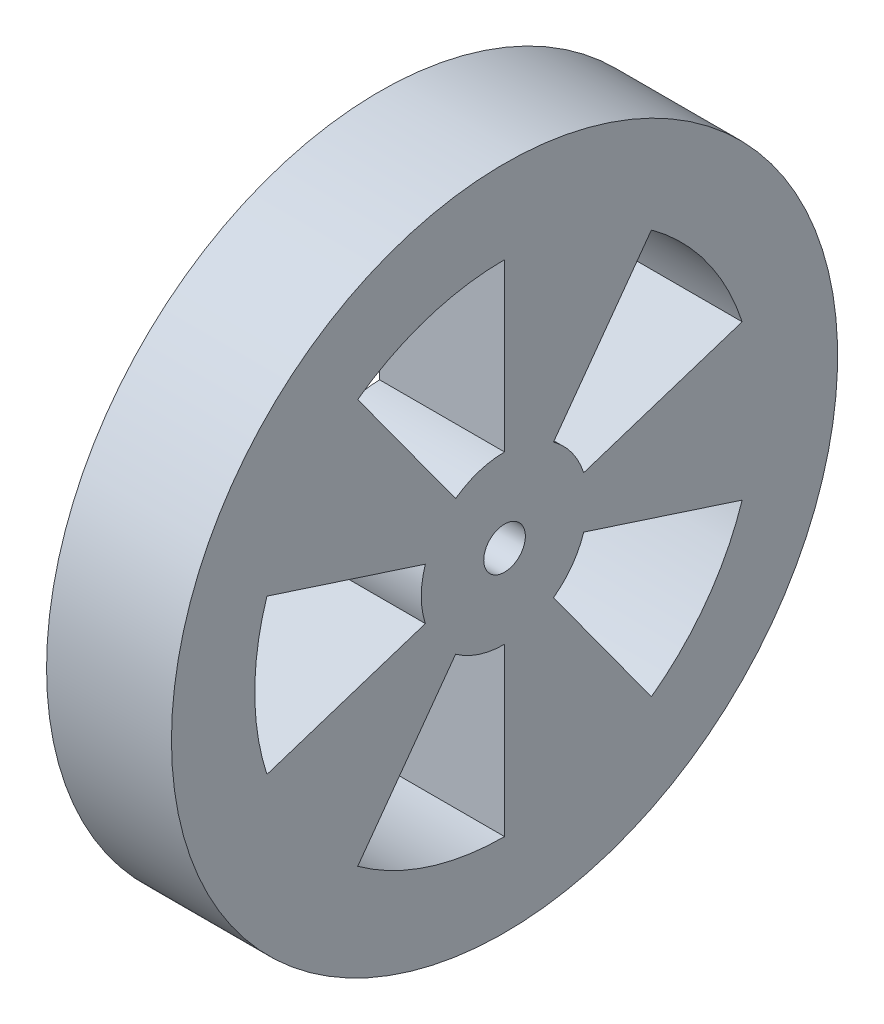
ISO-10303-21;
HEADER;
FILE_DESCRIPTION(('STEP AP214'),'2;1');
FILE_NAME('part.step','',(''),(''),'','','');
FILE_SCHEMA(('AUTOMOTIVE_DESIGN { 1 0 10303 214 1 1 1 1 }'));
ENDSEC;
DATA;
#1=APPLICATION_CONTEXT('core data for automotive mechanical design processes');
#2=APPLICATION_PROTOCOL_DEFINITION('international standard','automotive_design',2000,#1);
#3=PRODUCT_CONTEXT('',#1,'mechanical');
#4=PRODUCT('Part','Part','',(#3));
#5=PRODUCT_RELATED_PRODUCT_CATEGORY('part','',(#4));
#6=PRODUCT_DEFINITION_FORMATION('','',#4);
#7=PRODUCT_DEFINITION_CONTEXT('part definition',#1,'design');
#8=PRODUCT_DEFINITION('design','',#6,#7);
#9=PRODUCT_DEFINITION_SHAPE('','',#8);
#10=(LENGTH_UNIT() NAMED_UNIT(*) SI_UNIT(.MILLI.,.METRE.));
#11=(NAMED_UNIT(*) PLANE_ANGLE_UNIT() SI_UNIT($,.RADIAN.));
#12=(NAMED_UNIT(*) SI_UNIT($,.STERADIAN.) SOLID_ANGLE_UNIT());
#13=UNCERTAINTY_MEASURE_WITH_UNIT(LENGTH_MEASURE(1.E-05),#10,'distance_accuracy_value','');
#14=(GEOMETRIC_REPRESENTATION_CONTEXT(3) GLOBAL_UNCERTAINTY_ASSIGNED_CONTEXT((#13)) GLOBAL_UNIT_ASSIGNED_CONTEXT((#10,
#11,#12)) REPRESENTATION_CONTEXT('',''));
#15=CARTESIAN_POINT('',(0.,0.,0.));
#16=DIRECTION('',(0.,0.,1.));
#17=DIRECTION('',(1.,0.,0.));
#18=AXIS2_PLACEMENT_3D('',#15,#16,#17);
#19=CARTESIAN_POINT('',(19.05,0.,0.));
#20=DIRECTION('',(-1.,0.,0.));
#21=DIRECTION('',(0.,0.,1.));
#22=AXIS2_PLACEMENT_3D('',#19,#20,#21);
#23=CYLINDRICAL_SURFACE('',#22,38.1);
#24=CARTESIAN_POINT('',(0.,0.,0.));
#25=DIRECTION('',(1.,0.,0.));
#26=DIRECTION('',(0.,0.,-1.));
#27=AXIS2_PLACEMENT_3D('',#24,#25,#26);
#28=CIRCLE('',#27,38.1);
#29=CARTESIAN_POINT('',(0.,11.7735474856855,-36.2352532708454));
#30=VERTEX_POINT('',#29);
#31=CARTESIAN_POINT('',(0.,30.8235474856855,-22.3946181123432));
#32=VERTEX_POINT('',#31);
#33=EDGE_CURVE('E255',#30,#32,#28,.T.);
#34=ORIENTED_EDGE('',*,*,#33,.F.);
#35=DIRECTION('',(-1.,0.,0.));
#36=VECTOR('',#35,1.);
#37=CARTESIAN_POINT('',(19.05,11.7735474856855,-36.2352532708454));
#38=LINE('',#37,#36);
#39=CARTESIAN_POINT('',(19.05,11.7735474856855,-36.2352532708454));
#40=VERTEX_POINT('',#39);
#41=EDGE_CURVE('E11',#40,#30,#38,.T.);
#42=ORIENTED_EDGE('',*,*,#41,.F.);
#43=CARTESIAN_POINT('',(19.05,0.,0.));
#44=DIRECTION('',(1.,0.,0.));
#45=DIRECTION('',(0.,0.,-1.));
#46=AXIS2_PLACEMENT_3D('',#43,#44,#45);
#47=CIRCLE('',#46,38.1);
#48=CARTESIAN_POINT('',(19.05,30.8235474856855,-22.3946181123432));
#49=VERTEX_POINT('',#48);
#50=EDGE_CURVE('E215',#40,#49,#47,.T.);
#51=ORIENTED_EDGE('',*,*,#50,.T.);
#52=DIRECTION('',(-1.,0.,0.));
#53=VECTOR('',#52,1.);
#54=CARTESIAN_POINT('',(19.05,30.8235474856855,-22.3946181123432));
#55=LINE('',#54,#53);
#56=EDGE_CURVE('E136',#49,#32,#55,.T.);
#57=ORIENTED_EDGE('',*,*,#56,.T.);
#58=EDGE_LOOP('',(#34,#42,#51,#57));
#59=FACE_BOUND('',#58,.T.);
#60=ADVANCED_FACE('F45',(#59),#23,.F.);
#61=CARTESIAN_POINT('',(19.05,0.,0.));
#62=DIRECTION('',(0.,0.951056516295154,0.309016994374947));
#63=DIRECTION('',(0.,-0.309016994374947,0.951056516295154));
#64=AXIS2_PLACEMENT_3D('',#61,#62,#63);
#65=PLANE('',#64);
#66=DIRECTION('',(0.,0.309016994374948,-0.951056516295154));
#67=VECTOR('',#66,1.);
#68=CARTESIAN_POINT('',(0.,0.,0.));
#69=LINE('',#68,#67);
#70=CARTESIAN_POINT('',(0.,3.92451582856183,-12.0784177569484));
#71=VERTEX_POINT('',#70);
#72=EDGE_CURVE('E200',#71,#30,#69,.T.);
#73=ORIENTED_EDGE('',*,*,#72,.F.);
#74=DIRECTION('',(-1.,0.,0.));
#75=VECTOR('',#74,1.);
#76=CARTESIAN_POINT('',(19.05,3.92451582856183,-12.0784177569484));
#77=LINE('',#76,#75);
#78=CARTESIAN_POINT('',(19.05,3.92451582856183,-12.0784177569484));
#79=VERTEX_POINT('',#78);
#80=EDGE_CURVE('E56',#79,#71,#77,.T.);
#81=ORIENTED_EDGE('',*,*,#80,.F.);
#82=DIRECTION('',(0.,0.309016994374948,-0.951056516295154));
#83=VECTOR('',#82,1.);
#84=CARTESIAN_POINT('',(19.05,0.,0.));
#85=LINE('',#84,#83);
#86=EDGE_CURVE('E198',#79,#40,#85,.T.);
#87=ORIENTED_EDGE('',*,*,#86,.T.);
#88=ORIENTED_EDGE('',*,*,#41,.T.);
#89=EDGE_LOOP('',(#73,#81,#87,#88));
#90=FACE_BOUND('',#89,.T.);
#91=ADVANCED_FACE('F196',(#90),#65,.T.);
#92=CARTESIAN_POINT('',(19.05,0.,0.));
#93=DIRECTION('',(-1.,0.,0.));
#94=DIRECTION('',(0.,0.,1.));
#95=AXIS2_PLACEMENT_3D('',#92,#93,#94);
#96=CYLINDRICAL_SURFACE('',#95,12.7);
#97=CARTESIAN_POINT('',(0.,0.,0.));
#98=DIRECTION('',(1.,0.,0.));
#99=DIRECTION('',(0.,0.,-1.));
#100=AXIS2_PLACEMENT_3D('',#97,#98,#99);
#101=CIRCLE('',#100,12.7);
#102=CARTESIAN_POINT('',(0.,10.2745158285618,-7.46487270411441));
#103=VERTEX_POINT('',#102);
#104=EDGE_CURVE('E245',#71,#103,#101,.T.);
#105=ORIENTED_EDGE('',*,*,#104,.T.);
#106=DIRECTION('',(-1.,0.,0.));
#107=VECTOR('',#106,1.);
#108=CARTESIAN_POINT('',(19.05,10.2745158285618,-7.46487270411441));
#109=LINE('',#108,#107);
#110=CARTESIAN_POINT('',(19.05,10.2745158285618,-7.46487270411441));
#111=VERTEX_POINT('',#110);
#112=EDGE_CURVE('E204',#111,#103,#109,.T.);
#113=ORIENTED_EDGE('',*,*,#112,.F.);
#114=CARTESIAN_POINT('',(19.05,0.,0.));
#115=DIRECTION('',(1.,0.,0.));
#116=DIRECTION('',(0.,0.,-1.));
#117=AXIS2_PLACEMENT_3D('',#114,#115,#116);
#118=CIRCLE('',#117,12.7);
#119=EDGE_CURVE('E207',#79,#111,#118,.T.);
#120=ORIENTED_EDGE('',*,*,#119,.F.);
#121=ORIENTED_EDGE('',*,*,#80,.T.);
#122=EDGE_LOOP('',(#105,#113,#120,#121));
#123=FACE_BOUND('',#122,.T.);
#124=ADVANCED_FACE('F208',(#123),#96,.T.);
#125=CARTESIAN_POINT('',(19.05,0.,0.));
#126=DIRECTION('',(0.,0.,1.));
#127=DIRECTION('',(1.,0.,0.));
#128=AXIS2_PLACEMENT_3D('',#125,#126,#127);
#129=PLANE('',#128);
#130=DIRECTION('',(0.,1.,0.));
#131=VECTOR('',#130,1.);
#132=CARTESIAN_POINT('',(0.,0.,0.));
#133=LINE('',#132,#131);
#134=CARTESIAN_POINT('',(0.,12.7,0.));
#135=VERTEX_POINT('',#134);
#136=CARTESIAN_POINT('',(0.,38.1,0.));
#137=VERTEX_POINT('',#136);
#138=EDGE_CURVE('E274',#135,#137,#133,.T.);
#139=ORIENTED_EDGE('',*,*,#138,.F.);
#140=DIRECTION('',(-1.,0.,0.));
#141=VECTOR('',#140,1.);
#142=CARTESIAN_POINT('',(19.05,12.7,0.));
#143=LINE('',#142,#141);
#144=CARTESIAN_POINT('',(19.05,12.7,0.));
#145=VERTEX_POINT('',#144);
#146=EDGE_CURVE('E299',#145,#135,#143,.T.);
#147=ORIENTED_EDGE('',*,*,#146,.F.);
#148=DIRECTION('',(0.,1.,0.));
#149=VECTOR('',#148,1.);
#150=CARTESIAN_POINT('',(19.05,0.,0.));
#151=LINE('',#150,#149);
#152=CARTESIAN_POINT('',(19.05,38.1,0.));
#153=VERTEX_POINT('',#152);
#154=EDGE_CURVE('E514',#145,#153,#151,.T.);
#155=ORIENTED_EDGE('',*,*,#154,.T.);
#156=DIRECTION('',(-1.,0.,0.));
#157=VECTOR('',#156,1.);
#158=CARTESIAN_POINT('',(19.05,38.1,0.));
#159=LINE('',#158,#157);
#160=EDGE_CURVE('E302',#153,#137,#159,.T.);
#161=ORIENTED_EDGE('',*,*,#160,.T.);
#162=EDGE_LOOP('',(#139,#147,#155,#161));
#163=FACE_BOUND('',#162,.T.);
#164=ADVANCED_FACE('F458',(#163),#129,.T.);
#165=CARTESIAN_POINT('',(0.,10.2745158285618,7.46487270411441));
#166=VERTEX_POINT('',#165);
#167=EDGE_CURVE('E278',#135,#166,#101,.T.);
#168=ORIENTED_EDGE('',*,*,#167,.T.);
#169=DIRECTION('',(-1.,0.,0.));
#170=VECTOR('',#169,1.);
#171=CARTESIAN_POINT('',(19.05,10.2745158285618,7.46487270411441));
#172=LINE('',#171,#170);
#173=CARTESIAN_POINT('',(19.05,10.2745158285618,7.46487270411441));
#174=VERTEX_POINT('',#173);
#175=EDGE_CURVE('E309',#174,#166,#172,.T.);
#176=ORIENTED_EDGE('',*,*,#175,.F.);
#177=EDGE_CURVE('E211',#145,#174,#118,.T.);
#178=ORIENTED_EDGE('',*,*,#177,.F.);
#179=ORIENTED_EDGE('',*,*,#146,.T.);
#180=EDGE_LOOP('',(#168,#176,#178,#179));
#181=FACE_BOUND('',#180,.T.);
#182=ADVANCED_FACE('F459',(#181),#96,.T.);
#183=CARTESIAN_POINT('',(19.05,0.,0.));
#184=DIRECTION('',(0.,-0.587785252292473,0.809016994374947));
#185=DIRECTION('',(0.,-0.809016994374947,-0.587785252292473));
#186=AXIS2_PLACEMENT_3D('',#183,#184,#185);
#187=PLANE('',#186);
#188=DIRECTION('',(0.,0.809016994374947,0.587785252292473));
#189=VECTOR('',#188,1.);
#190=CARTESIAN_POINT('',(0.,0.,0.));
#191=LINE('',#190,#189);
#192=CARTESIAN_POINT('',(0.,30.8235474856855,22.3946181123432));
#193=VERTEX_POINT('',#192);
#194=EDGE_CURVE('E279',#166,#193,#191,.T.);
#195=ORIENTED_EDGE('',*,*,#194,.T.);
#196=DIRECTION('',(-1.,0.,0.));
#197=VECTOR('',#196,1.);
#198=CARTESIAN_POINT('',(19.05,30.8235474856855,22.3946181123432));
#199=LINE('',#198,#197);
#200=CARTESIAN_POINT('',(19.05,30.8235474856855,22.3946181123432));
#201=VERTEX_POINT('',#200);
#202=EDGE_CURVE('E305',#201,#193,#199,.T.);
#203=ORIENTED_EDGE('',*,*,#202,.F.);
#204=DIRECTION('',(0.,0.809016994374947,0.587785252292473));
#205=VECTOR('',#204,1.);
#206=CARTESIAN_POINT('',(19.05,0.,0.));
#207=LINE('',#206,#205);
#208=EDGE_CURVE('E224',#174,#201,#207,.T.);
#209=ORIENTED_EDGE('',*,*,#208,.F.);
#210=ORIENTED_EDGE('',*,*,#175,.T.);
#211=EDGE_LOOP('',(#195,#203,#209,#210));
#212=FACE_BOUND('',#211,.T.);
#213=ADVANCED_FACE('F466',(#212),#187,.F.);
#214=CARTESIAN_POINT('',(19.05,0.,0.));
#215=DIRECTION('',(0.,-0.951056516295154,0.309016994374947));
#216=DIRECTION('',(0.,-0.309016994374947,-0.951056516295154));
#217=AXIS2_PLACEMENT_3D('',#214,#215,#216);
#218=PLANE('',#217);
#219=DIRECTION('',(0.,0.309016994374947,0.951056516295154));
#220=VECTOR('',#219,1.);
#221=CARTESIAN_POINT('',(0.,0.,0.));
#222=LINE('',#221,#220);
#223=CARTESIAN_POINT('',(0.,3.92451582856183,12.0784177569484));
#224=VERTEX_POINT('',#223);
#225=CARTESIAN_POINT('',(0.,11.7735474856855,36.2352532708454));
#226=VERTEX_POINT('',#225);
#227=EDGE_CURVE('E264',#224,#226,#222,.T.);
#228=ORIENTED_EDGE('',*,*,#227,.F.);
#229=DIRECTION('',(-1.,0.,0.));
#230=VECTOR('',#229,1.);
#231=CARTESIAN_POINT('',(19.05,3.92451582856183,12.0784177569484));
#232=LINE('',#231,#230);
#233=CARTESIAN_POINT('',(19.05,3.92451582856183,12.0784177569484));
#234=VERTEX_POINT('',#233);
#235=EDGE_CURVE('E306',#234,#224,#232,.T.);
#236=ORIENTED_EDGE('',*,*,#235,.F.);
#237=DIRECTION('',(0.,0.309016994374947,0.951056516295154));
#238=VECTOR('',#237,1.);
#239=CARTESIAN_POINT('',(19.05,0.,0.));
#240=LINE('',#239,#238);
#241=CARTESIAN_POINT('',(19.05,11.7735474856855,36.2352532708454));
#242=VERTEX_POINT('',#241);
#243=EDGE_CURVE('E501',#234,#242,#240,.T.);
#244=ORIENTED_EDGE('',*,*,#243,.T.);
#245=DIRECTION('',(-1.,0.,0.));
#246=VECTOR('',#245,1.);
#247=CARTESIAN_POINT('',(19.05,11.7735474856855,36.2352532708454));
#248=LINE('',#247,#246);
#249=EDGE_CURVE('E315',#242,#226,#248,.T.);
#250=ORIENTED_EDGE('',*,*,#249,.T.);
#251=EDGE_LOOP('',(#228,#236,#244,#250));
#252=FACE_BOUND('',#251,.T.);
#253=ADVANCED_FACE('F471',(#252),#218,.T.);
#254=CARTESIAN_POINT('',(0.,-3.92451582856183,12.0784177569484));
#255=VERTEX_POINT('',#254);
#256=EDGE_CURVE('E268',#224,#255,#101,.T.);
#257=ORIENTED_EDGE('',*,*,#256,.T.);
#258=DIRECTION('',(-1.,0.,0.));
#259=VECTOR('',#258,1.);
#260=CARTESIAN_POINT('',(19.05,-3.92451582856183,12.0784177569484));
#261=LINE('',#260,#259);
#262=CARTESIAN_POINT('',(19.05,-3.92451582856183,12.0784177569484));
#263=VERTEX_POINT('',#262);
#264=EDGE_CURVE('E322',#263,#255,#261,.T.);
#265=ORIENTED_EDGE('',*,*,#264,.F.);
#266=EDGE_CURVE('E506',#234,#263,#118,.T.);
#267=ORIENTED_EDGE('',*,*,#266,.F.);
#268=ORIENTED_EDGE('',*,*,#235,.T.);
#269=EDGE_LOOP('',(#257,#265,#267,#268));
#270=FACE_BOUND('',#269,.T.);
#271=ADVANCED_FACE('F467',(#270),#96,.T.);
#272=CARTESIAN_POINT('',(19.05,0.,0.));
#273=DIRECTION('',(0.,-0.951056516295154,-0.309016994374948));
#274=DIRECTION('',(0.,0.309016994374948,-0.951056516295154));
#275=AXIS2_PLACEMENT_3D('',#272,#273,#274);
#276=PLANE('',#275);
#277=DIRECTION('',(0.,-0.309016994374948,0.951056516295154));
#278=VECTOR('',#277,1.);
#279=CARTESIAN_POINT('',(0.,0.,0.));
#280=LINE('',#279,#278);
#281=CARTESIAN_POINT('',(0.,-11.7735474856855,36.2352532708454));
#282=VERTEX_POINT('',#281);
#283=EDGE_CURVE('E269',#255,#282,#280,.T.);
#284=ORIENTED_EDGE('',*,*,#283,.T.);
#285=DIRECTION('',(-1.,0.,0.));
#286=VECTOR('',#285,1.);
#287=CARTESIAN_POINT('',(19.05,-11.7735474856855,36.2352532708454));
#288=LINE('',#287,#286);
#289=CARTESIAN_POINT('',(19.05,-11.7735474856855,36.2352532708454));
#290=VERTEX_POINT('',#289);
#291=EDGE_CURVE('E318',#290,#282,#288,.T.);
#292=ORIENTED_EDGE('',*,*,#291,.F.);
#293=DIRECTION('',(0.,-0.309016994374948,0.951056516295154));
#294=VECTOR('',#293,1.);
#295=CARTESIAN_POINT('',(19.05,0.,0.));
#296=LINE('',#295,#294);
#297=EDGE_CURVE('E515',#263,#290,#296,.T.);
#298=ORIENTED_EDGE('',*,*,#297,.F.);
#299=ORIENTED_EDGE('',*,*,#264,.T.);
#300=EDGE_LOOP('',(#284,#292,#298,#299));
#301=FACE_BOUND('',#300,.T.);
#302=ADVANCED_FACE('F474',(#301),#276,.F.);
#303=CARTESIAN_POINT('',(19.05,0.,0.));
#304=DIRECTION('',(0.,-0.587785252292473,-0.809016994374948));
#305=DIRECTION('',(0.,0.809016994374948,-0.587785252292473));
#306=AXIS2_PLACEMENT_3D('',#303,#304,#305);
#307=PLANE('',#306);
#308=DIRECTION('',(0.,-0.809016994374948,0.587785252292473));
#309=VECTOR('',#308,1.);
#310=CARTESIAN_POINT('',(0.,0.,0.));
#311=LINE('',#310,#309);
#312=CARTESIAN_POINT('',(0.,-10.2745158285618,7.46487270411441));
#313=VERTEX_POINT('',#312);
#314=CARTESIAN_POINT('',(0.,-30.8235474856855,22.3946181123432));
#315=VERTEX_POINT('',#314);
#316=EDGE_CURVE('E254',#313,#315,#311,.T.);
#317=ORIENTED_EDGE('',*,*,#316,.F.);
#318=DIRECTION('',(-1.,0.,0.));
#319=VECTOR('',#318,1.);
#320=CARTESIAN_POINT('',(19.05,-10.2745158285618,7.46487270411441));
#321=LINE('',#320,#319);
#322=CARTESIAN_POINT('',(19.05,-10.2745158285618,7.46487270411441));
#323=VERTEX_POINT('',#322);
#324=EDGE_CURVE('E319',#323,#313,#321,.T.);
#325=ORIENTED_EDGE('',*,*,#324,.F.);
#326=DIRECTION('',(0.,-0.809016994374948,0.587785252292473));
#327=VECTOR('',#326,1.);
#328=CARTESIAN_POINT('',(19.05,0.,0.));
#329=LINE('',#328,#327);
#330=CARTESIAN_POINT('',(19.05,-30.8235474856855,22.3946181123432));
#331=VERTEX_POINT('',#330);
#332=EDGE_CURVE('E494',#323,#331,#329,.T.);
#333=ORIENTED_EDGE('',*,*,#332,.T.);
#334=DIRECTION('',(-1.,0.,0.));
#335=VECTOR('',#334,1.);
#336=CARTESIAN_POINT('',(19.05,-30.8235474856855,22.3946181123432));
#337=LINE('',#336,#335);
#338=EDGE_CURVE('E328',#331,#315,#337,.T.);
#339=ORIENTED_EDGE('',*,*,#338,.T.);
#340=EDGE_LOOP('',(#317,#325,#333,#339));
#341=FACE_BOUND('',#340,.T.);
#342=ADVANCED_FACE('F479',(#341),#307,.T.);
#343=CARTESIAN_POINT('',(0.,-12.7,0.));
#344=VERTEX_POINT('',#343);
#345=EDGE_CURVE('E246',#313,#344,#101,.T.);
#346=ORIENTED_EDGE('',*,*,#345,.T.);
#347=DIRECTION('',(-1.,0.,0.));
#348=VECTOR('',#347,1.);
#349=CARTESIAN_POINT('',(19.05,-12.7,0.));
#350=LINE('',#349,#348);
#351=CARTESIAN_POINT('',(19.05,-12.7,0.));
#352=VERTEX_POINT('',#351);
#353=EDGE_CURVE('E334',#352,#344,#350,.T.);
#354=ORIENTED_EDGE('',*,*,#353,.F.);
#355=EDGE_CURVE('E497',#323,#352,#118,.T.);
#356=ORIENTED_EDGE('',*,*,#355,.F.);
#357=ORIENTED_EDGE('',*,*,#324,.T.);
#358=EDGE_LOOP('',(#346,#354,#356,#357));
#359=FACE_BOUND('',#358,.T.);
#360=ADVANCED_FACE('F376',(#359),#96,.T.);
#361=CARTESIAN_POINT('',(19.05,0.,0.));
#362=DIRECTION('',(0.,0.,-1.));
#363=DIRECTION('',(0.,1.,0.));
#364=AXIS2_PLACEMENT_3D('',#361,#362,#363);
#365=PLANE('',#364);
#366=DIRECTION('',(0.,-1.,0.));
#367=VECTOR('',#366,1.);
#368=CARTESIAN_POINT('',(0.,0.,0.));
#369=LINE('',#368,#367);
#370=CARTESIAN_POINT('',(0.,-38.1,0.));
#371=VERTEX_POINT('',#370);
#372=EDGE_CURVE('E260',#344,#371,#369,.T.);
#373=ORIENTED_EDGE('',*,*,#372,.T.);
#374=DIRECTION('',(-1.,0.,0.));
#375=VECTOR('',#374,1.);
#376=CARTESIAN_POINT('',(19.05,-38.1,0.));
#377=LINE('',#376,#375);
#378=CARTESIAN_POINT('',(19.05,-38.1,0.));
#379=VERTEX_POINT('',#378);
#380=EDGE_CURVE('E331',#379,#371,#377,.T.);
#381=ORIENTED_EDGE('',*,*,#380,.F.);
#382=DIRECTION('',(0.,-1.,0.));
#383=VECTOR('',#382,1.);
#384=CARTESIAN_POINT('',(19.05,0.,0.));
#385=LINE('',#384,#383);
#386=EDGE_CURVE('E426',#352,#379,#385,.T.);
#387=ORIENTED_EDGE('',*,*,#386,.F.);
#388=ORIENTED_EDGE('',*,*,#353,.T.);
#389=EDGE_LOOP('',(#373,#381,#387,#388));
#390=FACE_BOUND('',#389,.T.);
#391=ADVANCED_FACE('F423',(#390),#365,.F.);
#392=CARTESIAN_POINT('',(19.05,0.,0.));
#393=DIRECTION('',(0.,0.587785252292473,-0.809016994374947));
#394=DIRECTION('',(0.,0.809016994374947,0.587785252292473));
#395=AXIS2_PLACEMENT_3D('',#392,#393,#394);
#396=PLANE('',#395);
#397=DIRECTION('',(0.,-0.809016994374947,-0.587785252292473));
#398=VECTOR('',#397,1.);
#399=CARTESIAN_POINT('',(0.,0.,0.));
#400=LINE('',#399,#398);
#401=CARTESIAN_POINT('',(0.,-10.2745158285618,-7.46487270411441));
#402=VERTEX_POINT('',#401);
#403=CARTESIAN_POINT('',(0.,-30.8235474856855,-22.3946181123432));
#404=VERTEX_POINT('',#403);
#405=EDGE_CURVE('E237',#402,#404,#400,.T.);
#406=ORIENTED_EDGE('',*,*,#405,.F.);
#407=DIRECTION('',(-1.,0.,0.));
#408=VECTOR('',#407,1.);
#409=CARTESIAN_POINT('',(19.05,-10.2745158285618,-7.46487270411441));
#410=LINE('',#409,#408);
#411=CARTESIAN_POINT('',(19.05,-10.2745158285618,-7.46487270411441));
#412=VERTEX_POINT('',#411);
#413=EDGE_CURVE('E49',#412,#402,#410,.T.);
#414=ORIENTED_EDGE('',*,*,#413,.F.);
#415=DIRECTION('',(0.,-0.809016994374947,-0.587785252292473));
#416=VECTOR('',#415,1.);
#417=CARTESIAN_POINT('',(19.05,0.,0.));
#418=LINE('',#417,#416);
#419=CARTESIAN_POINT('',(19.05,-30.8235474856855,-22.3946181123432));
#420=VERTEX_POINT('',#419);
#421=EDGE_CURVE('E296',#412,#420,#418,.T.);
#422=ORIENTED_EDGE('',*,*,#421,.T.);
#423=DIRECTION('',(-1.,0.,0.));
#424=VECTOR('',#423,1.);
#425=CARTESIAN_POINT('',(19.05,-30.8235474856855,-22.3946181123432));
#426=LINE('',#425,#424);
#427=EDGE_CURVE('E236',#420,#404,#426,.T.);
#428=ORIENTED_EDGE('',*,*,#427,.T.);
#429=EDGE_LOOP('',(#406,#414,#422,#428));
#430=FACE_BOUND('',#429,.T.);
#431=ADVANCED_FACE('F47',(#430),#396,.T.);
#432=CARTESIAN_POINT('',(0.,-3.92451582856183,-12.0784177569484));
#433=VERTEX_POINT('',#432);
#434=EDGE_CURVE('E241',#402,#433,#101,.T.);
#435=ORIENTED_EDGE('',*,*,#434,.T.);
#436=DIRECTION('',(-1.,0.,0.));
#437=VECTOR('',#436,1.);
#438=CARTESIAN_POINT('',(19.05,-3.92451582856183,-12.0784177569484));
#439=LINE('',#438,#437);
#440=CARTESIAN_POINT('',(19.05,-3.92451582856183,-12.0784177569484));
#441=VERTEX_POINT('',#440);
#442=EDGE_CURVE('E344',#441,#433,#439,.T.);
#443=ORIENTED_EDGE('',*,*,#442,.F.);
#444=EDGE_CURVE('E212',#412,#441,#118,.T.);
#445=ORIENTED_EDGE('',*,*,#444,.F.);
#446=ORIENTED_EDGE('',*,*,#413,.T.);
#447=EDGE_LOOP('',(#435,#443,#445,#446));
#448=FACE_BOUND('',#447,.T.);
#449=ADVANCED_FACE('F354',(#448),#96,.T.);
#450=CARTESIAN_POINT('',(19.05,0.,0.));
#451=DIRECTION('',(0.,0.951056516295154,-0.309016994374947));
#452=DIRECTION('',(0.,0.309016994374947,0.951056516295154));
#453=AXIS2_PLACEMENT_3D('',#450,#451,#452);
#454=PLANE('',#453);
#455=DIRECTION('',(0.,-0.309016994374947,-0.951056516295154));
#456=VECTOR('',#455,1.);
#457=CARTESIAN_POINT('',(0.,0.,0.));
#458=LINE('',#457,#456);
#459=CARTESIAN_POINT('',(0.,-11.7735474856855,-36.2352532708454));
#460=VERTEX_POINT('',#459);
#461=EDGE_CURVE('E244',#433,#460,#458,.T.);
#462=ORIENTED_EDGE('',*,*,#461,.T.);
#463=DIRECTION('',(-1.,0.,0.));
#464=VECTOR('',#463,1.);
#465=CARTESIAN_POINT('',(19.05,-11.7735474856855,-36.2352532708454));
#466=LINE('',#465,#464);
#467=CARTESIAN_POINT('',(19.05,-11.7735474856855,-36.2352532708454));
#468=VERTEX_POINT('',#467);
#469=EDGE_CURVE('E342',#468,#460,#466,.T.);
#470=ORIENTED_EDGE('',*,*,#469,.F.);
#471=DIRECTION('',(0.,-0.309016994374947,-0.951056516295154));
#472=VECTOR('',#471,1.);
#473=CARTESIAN_POINT('',(19.05,0.,0.));
#474=LINE('',#473,#472);
#475=EDGE_CURVE('E511',#441,#468,#474,.T.);
#476=ORIENTED_EDGE('',*,*,#475,.F.);
#477=ORIENTED_EDGE('',*,*,#442,.T.);
#478=EDGE_LOOP('',(#462,#470,#476,#477));
#479=FACE_BOUND('',#478,.T.);
#480=ADVANCED_FACE('F365',(#479),#454,.F.);
#481=CARTESIAN_POINT('',(19.05,0.,0.));
#482=DIRECTION('',(-1.,0.,0.));
#483=DIRECTION('',(0.,0.,1.));
#484=AXIS2_PLACEMENT_3D('',#481,#482,#483);
#485=CYLINDRICAL_SURFACE('',#484,50.8);
#486=CARTESIAN_POINT('',(19.05,0.,0.));
#487=DIRECTION('',(1.,0.,0.));
#488=DIRECTION('',(0.,0.,-1.));
#489=AXIS2_PLACEMENT_3D('',#486,#487,#488);
#490=CIRCLE('',#489,50.8);
#491=CARTESIAN_POINT('',(19.05,0.,50.8));
#492=VERTEX_POINT('',#491);
#493=EDGE_CURVE('E228',#492,#492,#490,.T.);
#494=CARTESIAN_POINT('',(0.,0.,0.));
#495=DIRECTION('',(1.,0.,0.));
#496=DIRECTION('',(0.,0.,-1.));
#497=AXIS2_PLACEMENT_3D('',#494,#495,#496);
#498=CIRCLE('',#497,50.8);
#499=CARTESIAN_POINT('',(0.,0.,50.8));
#500=VERTEX_POINT('',#499);
#501=EDGE_CURVE('E288',#500,#500,#498,.T.);
#502=CARTESIAN_POINT('',(19.05,0.,50.8));
#503=CARTESIAN_POINT('',(18.8515625,0.,50.8));
#504=CARTESIAN_POINT('',(18.653125,0.,50.8));
#505=CARTESIAN_POINT('',(18.25625,0.,50.8));
#506=CARTESIAN_POINT('',(18.0578125,0.,50.8));
#507=CARTESIAN_POINT('',(17.6609375,0.,50.8));
#508=CARTESIAN_POINT('',(17.4625,0.,50.8));
#509=CARTESIAN_POINT('',(17.065625,0.,50.8));
#510=CARTESIAN_POINT('',(16.8671875,0.,50.8));
#511=CARTESIAN_POINT('',(16.4703125,0.,50.8));
#512=CARTESIAN_POINT('',(16.271875,0.,50.8));
#513=CARTESIAN_POINT('',(15.875,0.,50.8));
#514=CARTESIAN_POINT('',(15.6765625,0.,50.8));
#515=CARTESIAN_POINT('',(15.2796875,0.,50.8));
#516=CARTESIAN_POINT('',(15.08125,0.,50.8));
#517=CARTESIAN_POINT('',(14.684375,0.,50.8));
#518=CARTESIAN_POINT('',(14.4859375,0.,50.8));
#519=CARTESIAN_POINT('',(14.0890625,0.,50.8));
#520=CARTESIAN_POINT('',(13.890625,0.,50.8));
#521=CARTESIAN_POINT('',(13.49375,0.,50.8));
#522=CARTESIAN_POINT('',(13.2953125,0.,50.8));
#523=CARTESIAN_POINT('',(12.8984375,0.,50.8));
#524=CARTESIAN_POINT('',(12.7,0.,50.8));
#525=CARTESIAN_POINT('',(12.303125,0.,50.8));
#526=CARTESIAN_POINT('',(12.1046875,0.,50.8));
#527=CARTESIAN_POINT('',(11.7078125,0.,50.8));
#528=CARTESIAN_POINT('',(11.509375,0.,50.8));
#529=CARTESIAN_POINT('',(11.1125,0.,50.8));
#530=CARTESIAN_POINT('',(10.9140625,0.,50.8));
#531=CARTESIAN_POINT('',(10.5171875,0.,50.8));
#532=CARTESIAN_POINT('',(10.31875,0.,50.8));
#533=CARTESIAN_POINT('',(9.921875,0.,50.8));
#534=CARTESIAN_POINT('',(9.7234375,0.,50.8));
#535=CARTESIAN_POINT('',(9.3265625,0.,50.8));
#536=CARTESIAN_POINT('',(9.128125,0.,50.8));
#537=CARTESIAN_POINT('',(8.73125,0.,50.8));
#538=CARTESIAN_POINT('',(8.5328125,0.,50.8));
#539=CARTESIAN_POINT('',(8.1359375,0.,50.8));
#540=CARTESIAN_POINT('',(7.9375,0.,50.8));
#541=CARTESIAN_POINT('',(7.540625,0.,50.8));
#542=CARTESIAN_POINT('',(7.3421875,0.,50.8));
#543=CARTESIAN_POINT('',(6.9453125,0.,50.8));
#544=CARTESIAN_POINT('',(6.746875,0.,50.8));
#545=CARTESIAN_POINT('',(6.35,0.,50.8));
#546=CARTESIAN_POINT('',(6.1515625,0.,50.8));
#547=CARTESIAN_POINT('',(5.7546875,0.,50.8));
#548=CARTESIAN_POINT('',(5.55625,0.,50.8));
#549=CARTESIAN_POINT('',(5.159375,0.,50.8));
#550=CARTESIAN_POINT('',(4.9609375,0.,50.8));
#551=CARTESIAN_POINT('',(4.5640625,0.,50.8));
#552=CARTESIAN_POINT('',(4.365625,0.,50.8));
#553=CARTESIAN_POINT('',(3.96875,0.,50.8));
#554=CARTESIAN_POINT('',(3.7703125,0.,50.8));
#555=CARTESIAN_POINT('',(3.3734375,0.,50.8));
#556=CARTESIAN_POINT('',(3.175,0.,50.8));
#557=CARTESIAN_POINT('',(2.778125,0.,50.8));
#558=CARTESIAN_POINT('',(2.5796875,0.,50.8));
#559=CARTESIAN_POINT('',(2.1828125,0.,50.8));
#560=CARTESIAN_POINT('',(1.984375,0.,50.8));
#561=CARTESIAN_POINT('',(1.5875,0.,50.8));
#562=CARTESIAN_POINT('',(1.3890625,0.,50.8));
#563=CARTESIAN_POINT('',(0.992187500000001,0.,50.8));
#564=CARTESIAN_POINT('',(0.793750000000001,0.,50.8));
#565=CARTESIAN_POINT('',(0.396875,0.,50.8));
#566=CARTESIAN_POINT('',(0.1984375,0.,50.8));
#567=CARTESIAN_POINT('',(0.,0.,50.8));
#568=B_SPLINE_CURVE_WITH_KNOTS('',3,(#502,#503,#504,#505,#506,#507,#508,#509,#510,#511,#512,
#513,#514,#515,#516,#517,#518,#519,#520,#521,#522,#523,#524,#525,#526,#527,#528,#529,#530,#531,
#532,#533,#534,#535,#536,#537,#538,#539,#540,#541,#542,#543,#544,#545,#546,#547,#548,#549,#550,
#551,#552,#553,#554,#555,#556,#557,#558,#559,#560,#561,#562,#563,#564,#565,#566,#567),
.UNSPECIFIED.,.F.,.F.,(4,2,2,2,2,2,2,2,2,2,2,2,2,2,2,2,2,2,2,2,2,2,2,2,2,2,2,2,2,2,2,2,4),(0.,
0.595312499999997,1.190625,1.7859375,2.38125,2.9765625,3.571875,4.1671875,4.7625,5.3578125,
5.953125,6.5484375,7.14375,7.7390625,8.334375,8.9296875,9.525,10.1203125,10.715625,11.3109375,
11.90625,12.5015625,13.096875,13.6921875,14.2875,14.8828125,15.478125,16.0734375,16.66875,
17.2640625,17.859375,18.4546875,19.05),.UNSPECIFIED.);
#569=EDGE_CURVE('BSEAM367',#492,#500,#568,.T.);
#570=ORIENTED_EDGE('',*,*,#493,.F.);
#571=ORIENTED_EDGE('',*,*,#501,.T.);
#572=ORIENTED_EDGE('',*,*,#569,.T.);
#573=ORIENTED_EDGE('',*,*,#569,.F.);
#574=EDGE_LOOP('',(#570,#572,#571,#573));
#575=FACE_BOUND('',#574,.T.);
#576=ADVANCED_FACE('F367',(#575),#485,.T.);
#577=CARTESIAN_POINT('',(19.05,0.,0.));
#578=DIRECTION('',(0.,0.587785252292473,0.809016994374948));
#579=DIRECTION('',(0.,-0.809016994374948,0.587785252292473));
#580=AXIS2_PLACEMENT_3D('',#577,#578,#579);
#581=PLANE('',#580);
#582=DIRECTION('',(0.,0.809016994374948,-0.587785252292473));
#583=VECTOR('',#582,1.);
#584=CARTESIAN_POINT('',(0.,0.,0.));
#585=LINE('',#584,#583);
#586=EDGE_CURVE('E129',#103,#32,#585,.T.);
#587=ORIENTED_EDGE('',*,*,#586,.T.);
#588=ORIENTED_EDGE('',*,*,#56,.F.);
#589=DIRECTION('',(0.,0.809016994374948,-0.587785252292473));
#590=VECTOR('',#589,1.);
#591=CARTESIAN_POINT('',(19.05,0.,0.));
#592=LINE('',#591,#590);
#593=EDGE_CURVE('E65',#111,#49,#592,.T.);
#594=ORIENTED_EDGE('',*,*,#593,.F.);
#595=ORIENTED_EDGE('',*,*,#112,.T.);
#596=EDGE_LOOP('',(#587,#588,#594,#595));
#597=FACE_BOUND('',#596,.T.);
#598=ADVANCED_FACE('F372',(#597),#581,.F.);
#599=EDGE_CURVE('E283',#137,#193,#28,.T.);
#600=ORIENTED_EDGE('',*,*,#599,.F.);
#601=ORIENTED_EDGE('',*,*,#160,.F.);
#602=EDGE_CURVE('E219',#153,#201,#47,.T.);
#603=ORIENTED_EDGE('',*,*,#602,.T.);
#604=ORIENTED_EDGE('',*,*,#202,.T.);
#605=EDGE_LOOP('',(#600,#601,#603,#604));
#606=FACE_BOUND('',#605,.T.);
#607=ADVANCED_FACE('F380',(#606),#23,.F.);
#608=EDGE_CURVE('E273',#226,#282,#28,.T.);
#609=ORIENTED_EDGE('',*,*,#608,.F.);
#610=ORIENTED_EDGE('',*,*,#249,.F.);
#611=EDGE_CURVE('E502',#242,#290,#47,.T.);
#612=ORIENTED_EDGE('',*,*,#611,.T.);
#613=ORIENTED_EDGE('',*,*,#291,.T.);
#614=EDGE_LOOP('',(#609,#610,#612,#613));
#615=FACE_BOUND('',#614,.T.);
#616=ADVANCED_FACE('F390',(#615),#23,.F.);
#617=EDGE_CURVE('E256',#315,#371,#28,.T.);
#618=ORIENTED_EDGE('',*,*,#617,.F.);
#619=ORIENTED_EDGE('',*,*,#338,.F.);
#620=EDGE_CURVE('E421',#331,#379,#47,.T.);
#621=ORIENTED_EDGE('',*,*,#620,.T.);
#622=ORIENTED_EDGE('',*,*,#380,.T.);
#623=EDGE_LOOP('',(#618,#619,#621,#622));
#624=FACE_BOUND('',#623,.T.);
#625=ADVANCED_FACE('F388',(#624),#23,.F.);
#626=EDGE_CURVE('E250',#404,#460,#28,.T.);
#627=ORIENTED_EDGE('',*,*,#626,.F.);
#628=ORIENTED_EDGE('',*,*,#427,.F.);
#629=EDGE_CURVE('E221',#420,#468,#47,.T.);
#630=ORIENTED_EDGE('',*,*,#629,.T.);
#631=ORIENTED_EDGE('',*,*,#469,.T.);
#632=EDGE_LOOP('',(#627,#628,#630,#631));
#633=FACE_BOUND('',#632,.T.);
#634=ADVANCED_FACE('F363',(#633),#23,.F.);
#635=CARTESIAN_POINT('',(19.05,0.,0.));
#636=DIRECTION('',(-1.,0.,0.));
#637=DIRECTION('',(0.,0.,1.));
#638=AXIS2_PLACEMENT_3D('',#635,#636,#637);
#639=CYLINDRICAL_SURFACE('',#638,3.175);
#640=CARTESIAN_POINT('',(19.05,0.,0.));
#641=DIRECTION('',(1.,0.,0.));
#642=DIRECTION('',(0.,0.,-1.));
#643=AXIS2_PLACEMENT_3D('',#640,#641,#642);
#644=CIRCLE('',#643,3.175);
#645=CARTESIAN_POINT('',(19.05,0.,3.175));
#646=VERTEX_POINT('',#645);
#647=EDGE_CURVE('E232',#646,#646,#644,.T.);
#648=CARTESIAN_POINT('',(0.,0.,0.));
#649=DIRECTION('',(1.,0.,0.));
#650=DIRECTION('',(0.,0.,-1.));
#651=AXIS2_PLACEMENT_3D('',#648,#649,#650);
#652=CIRCLE('',#651,3.175);
#653=CARTESIAN_POINT('',(0.,0.,3.175));
#654=VERTEX_POINT('',#653);
#655=EDGE_CURVE('E292',#654,#654,#652,.T.);
#656=CARTESIAN_POINT('',(19.05,0.,3.175));
#657=CARTESIAN_POINT('',(18.8515625,0.,3.175));
#658=CARTESIAN_POINT('',(18.653125,0.,3.175));
#659=CARTESIAN_POINT('',(18.25625,0.,3.175));
#660=CARTESIAN_POINT('',(18.0578125,0.,3.175));
#661=CARTESIAN_POINT('',(17.6609375,0.,3.175));
#662=CARTESIAN_POINT('',(17.4625,0.,3.175));
#663=CARTESIAN_POINT('',(17.065625,0.,3.175));
#664=CARTESIAN_POINT('',(16.8671875,0.,3.175));
#665=CARTESIAN_POINT('',(16.4703125,0.,3.175));
#666=CARTESIAN_POINT('',(16.271875,0.,3.175));
#667=CARTESIAN_POINT('',(15.875,0.,3.175));
#668=CARTESIAN_POINT('',(15.6765625,0.,3.175));
#669=CARTESIAN_POINT('',(15.2796875,0.,3.175));
#670=CARTESIAN_POINT('',(15.08125,0.,3.175));
#671=CARTESIAN_POINT('',(14.684375,0.,3.175));
#672=CARTESIAN_POINT('',(14.4859375,0.,3.175));
#673=CARTESIAN_POINT('',(14.0890625,0.,3.175));
#674=CARTESIAN_POINT('',(13.890625,0.,3.175));
#675=CARTESIAN_POINT('',(13.49375,0.,3.175));
#676=CARTESIAN_POINT('',(13.2953125,0.,3.175));
#677=CARTESIAN_POINT('',(12.8984375,0.,3.175));
#678=CARTESIAN_POINT('',(12.7,0.,3.175));
#679=CARTESIAN_POINT('',(12.303125,0.,3.175));
#680=CARTESIAN_POINT('',(12.1046875,0.,3.175));
#681=CARTESIAN_POINT('',(11.7078125,0.,3.175));
#682=CARTESIAN_POINT('',(11.509375,0.,3.175));
#683=CARTESIAN_POINT('',(11.1125,0.,3.175));
#684=CARTESIAN_POINT('',(10.9140625,0.,3.175));
#685=CARTESIAN_POINT('',(10.5171875,0.,3.175));
#686=CARTESIAN_POINT('',(10.31875,0.,3.175));
#687=CARTESIAN_POINT('',(9.921875,0.,3.175));
#688=CARTESIAN_POINT('',(9.7234375,0.,3.175));
#689=CARTESIAN_POINT('',(9.3265625,0.,3.175));
#690=CARTESIAN_POINT('',(9.128125,0.,3.175));
#691=CARTESIAN_POINT('',(8.73125,0.,3.175));
#692=CARTESIAN_POINT('',(8.5328125,0.,3.175));
#693=CARTESIAN_POINT('',(8.1359375,0.,3.175));
#694=CARTESIAN_POINT('',(7.9375,0.,3.175));
#695=CARTESIAN_POINT('',(7.540625,0.,3.175));
#696=CARTESIAN_POINT('',(7.3421875,0.,3.175));
#697=CARTESIAN_POINT('',(6.9453125,0.,3.175));
#698=CARTESIAN_POINT('',(6.746875,0.,3.175));
#699=CARTESIAN_POINT('',(6.35,0.,3.175));
#700=CARTESIAN_POINT('',(6.1515625,0.,3.175));
#701=CARTESIAN_POINT('',(5.7546875,0.,3.175));
#702=CARTESIAN_POINT('',(5.55625,0.,3.175));
#703=CARTESIAN_POINT('',(5.159375,0.,3.175));
#704=CARTESIAN_POINT('',(4.9609375,0.,3.175));
#705=CARTESIAN_POINT('',(4.5640625,0.,3.175));
#706=CARTESIAN_POINT('',(4.365625,0.,3.175));
#707=CARTESIAN_POINT('',(3.96875,0.,3.175));
#708=CARTESIAN_POINT('',(3.7703125,0.,3.175));
#709=CARTESIAN_POINT('',(3.3734375,0.,3.175));
#710=CARTESIAN_POINT('',(3.175,0.,3.175));
#711=CARTESIAN_POINT('',(2.778125,0.,3.175));
#712=CARTESIAN_POINT('',(2.5796875,0.,3.175));
#713=CARTESIAN_POINT('',(2.1828125,0.,3.175));
#714=CARTESIAN_POINT('',(1.984375,0.,3.175));
#715=CARTESIAN_POINT('',(1.5875,0.,3.175));
#716=CARTESIAN_POINT('',(1.3890625,0.,3.175));
#717=CARTESIAN_POINT('',(0.992187500000001,0.,3.175));
#718=CARTESIAN_POINT('',(0.793750000000001,0.,3.175));
#719=CARTESIAN_POINT('',(0.396875,0.,3.175));
#720=CARTESIAN_POINT('',(0.1984375,0.,3.175));
#721=CARTESIAN_POINT('',(0.,0.,3.175));
#722=B_SPLINE_CURVE_WITH_KNOTS('',3,(#656,#657,#658,#659,#660,#661,#662,#663,#664,#665,#666,
#667,#668,#669,#670,#671,#672,#673,#674,#675,#676,#677,#678,#679,#680,#681,#682,#683,#684,#685,
#686,#687,#688,#689,#690,#691,#692,#693,#694,#695,#696,#697,#698,#699,#700,#701,#702,#703,#704,
#705,#706,#707,#708,#709,#710,#711,#712,#713,#714,#715,#716,#717,#718,#719,#720,#721),
.UNSPECIFIED.,.F.,.F.,(4,2,2,2,2,2,2,2,2,2,2,2,2,2,2,2,2,2,2,2,2,2,2,2,2,2,2,2,2,2,2,2,4),(0.,
0.595312499999997,1.190625,1.7859375,2.38125,2.9765625,3.571875,4.1671875,4.7625,5.3578125,
5.953125,6.5484375,7.14375,7.7390625,8.334375,8.9296875,9.525,10.1203125,10.715625,11.3109375,
11.90625,12.5015625,13.096875,13.6921875,14.2875,14.8828125,15.478125,16.0734375,16.66875,
17.2640625,17.859375,18.4546875,19.05),.UNSPECIFIED.);
#723=EDGE_CURVE('BSEAM387',#646,#654,#722,.T.);
#724=ORIENTED_EDGE('',*,*,#647,.T.);
#725=ORIENTED_EDGE('',*,*,#655,.F.);
#726=ORIENTED_EDGE('',*,*,#723,.T.);
#727=ORIENTED_EDGE('',*,*,#723,.F.);
#728=EDGE_LOOP('',(#724,#726,#725,#727));
#729=FACE_BOUND('',#728,.T.);
#730=ADVANCED_FACE('F387',(#729),#639,.F.);
#731=CARTESIAN_POINT('',(19.05,0.,0.));
#732=DIRECTION('',(1.,0.,0.));
#733=DIRECTION('',(0.,0.,-1.));
#734=AXIS2_PLACEMENT_3D('',#731,#732,#733);
#735=PLANE('',#734);
#736=ORIENTED_EDGE('',*,*,#421,.F.);
#737=ORIENTED_EDGE('',*,*,#444,.T.);
#738=ORIENTED_EDGE('',*,*,#475,.T.);
#739=ORIENTED_EDGE('',*,*,#629,.F.);
#740=EDGE_LOOP('',(#736,#737,#738,#739));
#741=FACE_BOUND('',#740,.T.);
#742=ORIENTED_EDGE('',*,*,#332,.F.);
#743=ORIENTED_EDGE('',*,*,#355,.T.);
#744=ORIENTED_EDGE('',*,*,#386,.T.);
#745=ORIENTED_EDGE('',*,*,#620,.F.);
#746=EDGE_LOOP('',(#742,#743,#744,#745));
#747=FACE_BOUND('',#746,.T.);
#748=ORIENTED_EDGE('',*,*,#243,.F.);
#749=ORIENTED_EDGE('',*,*,#266,.T.);
#750=ORIENTED_EDGE('',*,*,#297,.T.);
#751=ORIENTED_EDGE('',*,*,#611,.F.);
#752=EDGE_LOOP('',(#748,#749,#750,#751));
#753=FACE_BOUND('',#752,.T.);
#754=ORIENTED_EDGE('',*,*,#154,.F.);
#755=ORIENTED_EDGE('',*,*,#177,.T.);
#756=ORIENTED_EDGE('',*,*,#208,.T.);
#757=ORIENTED_EDGE('',*,*,#602,.F.);
#758=EDGE_LOOP('',(#754,#755,#756,#757));
#759=FACE_BOUND('',#758,.T.);
#760=ORIENTED_EDGE('',*,*,#50,.F.);
#761=ORIENTED_EDGE('',*,*,#86,.F.);
#762=ORIENTED_EDGE('',*,*,#119,.T.);
#763=ORIENTED_EDGE('',*,*,#593,.T.);
#764=EDGE_LOOP('',(#760,#761,#762,#763));
#765=FACE_BOUND('',#764,.T.);
#766=ORIENTED_EDGE('',*,*,#493,.T.);
#767=EDGE_LOOP('',(#766));
#768=FACE_BOUND('',#767,.T.);
#769=ORIENTED_EDGE('',*,*,#647,.F.);
#770=EDGE_LOOP('',(#769));
#771=FACE_BOUND('',#770,.T.);
#772=ADVANCED_FACE('F213',(#741,#747,#753,#759,#765,#768,#771),#735,.T.);
#773=CARTESIAN_POINT('',(0.,0.,0.));
#774=DIRECTION('',(1.,0.,0.));
#775=DIRECTION('',(0.,0.,-1.));
#776=AXIS2_PLACEMENT_3D('',#773,#774,#775);
#777=PLANE('',#776);
#778=ORIENTED_EDGE('',*,*,#405,.T.);
#779=ORIENTED_EDGE('',*,*,#626,.T.);
#780=ORIENTED_EDGE('',*,*,#461,.F.);
#781=ORIENTED_EDGE('',*,*,#434,.F.);
#782=EDGE_LOOP('',(#778,#779,#780,#781));
#783=FACE_BOUND('',#782,.T.);
#784=ORIENTED_EDGE('',*,*,#316,.T.);
#785=ORIENTED_EDGE('',*,*,#617,.T.);
#786=ORIENTED_EDGE('',*,*,#372,.F.);
#787=ORIENTED_EDGE('',*,*,#345,.F.);
#788=EDGE_LOOP('',(#784,#785,#786,#787));
#789=FACE_BOUND('',#788,.T.);
#790=ORIENTED_EDGE('',*,*,#227,.T.);
#791=ORIENTED_EDGE('',*,*,#608,.T.);
#792=ORIENTED_EDGE('',*,*,#283,.F.);
#793=ORIENTED_EDGE('',*,*,#256,.F.);
#794=EDGE_LOOP('',(#790,#791,#792,#793));
#795=FACE_BOUND('',#794,.T.);
#796=ORIENTED_EDGE('',*,*,#138,.T.);
#797=ORIENTED_EDGE('',*,*,#599,.T.);
#798=ORIENTED_EDGE('',*,*,#194,.F.);
#799=ORIENTED_EDGE('',*,*,#167,.F.);
#800=EDGE_LOOP('',(#796,#797,#798,#799));
#801=FACE_BOUND('',#800,.T.);
#802=ORIENTED_EDGE('',*,*,#33,.T.);
#803=ORIENTED_EDGE('',*,*,#586,.F.);
#804=ORIENTED_EDGE('',*,*,#104,.F.);
#805=ORIENTED_EDGE('',*,*,#72,.T.);
#806=EDGE_LOOP('',(#802,#803,#804,#805));
#807=FACE_BOUND('',#806,.T.);
#808=ORIENTED_EDGE('',*,*,#501,.F.);
#809=EDGE_LOOP('',(#808));
#810=FACE_BOUND('',#809,.T.);
#811=ORIENTED_EDGE('',*,*,#655,.T.);
#812=EDGE_LOOP('',(#811));
#813=FACE_BOUND('',#812,.T.);
#814=ADVANCED_FACE('F357',(#783,#789,#795,#801,#807,#810,#813),#777,.F.);
#815=CLOSED_SHELL('',(#60,#91,#124,#164,#182,#213,#253,#271,#302,#342,#360,#391,#431,#449,#480,
#576,#598,#607,#616,#625,#634,#730,#772,#814));
#816=MANIFOLD_SOLID_BREP('B2',#815);
#817=ADVANCED_BREP_SHAPE_REPRESENTATION('',(#18,#816),#14);
#818=SHAPE_DEFINITION_REPRESENTATION(#9,#817);
ENDSEC;
END-ISO-10303-21;
